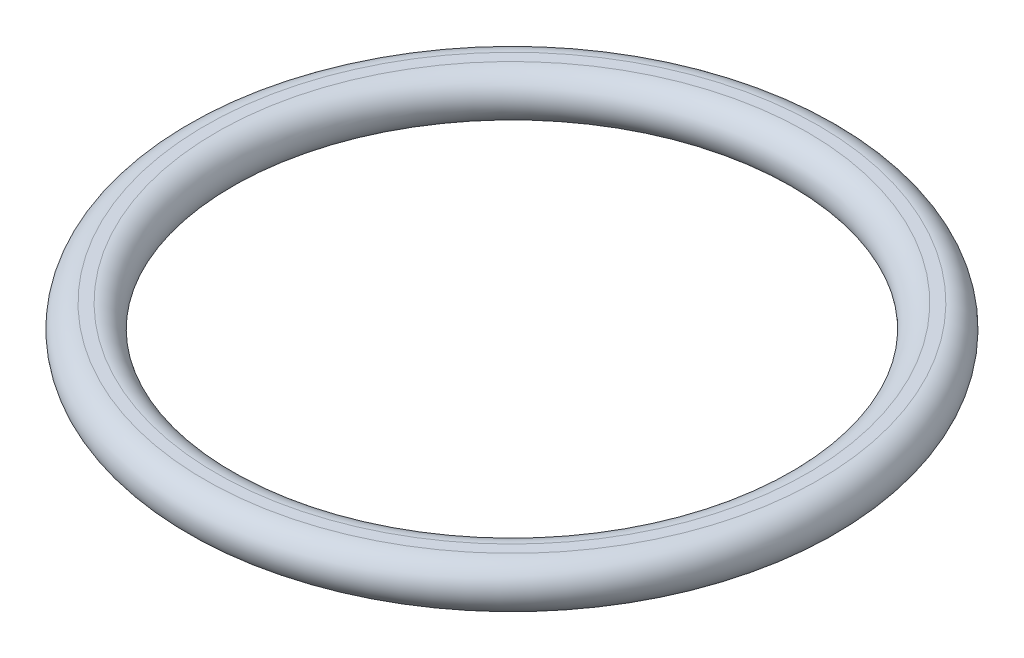
ISO-10303-21;
HEADER;
FILE_DESCRIPTION(('STEP AP214'),'2;1');
FILE_NAME('part.step','',(''),(''),'','','');
FILE_SCHEMA(('AUTOMOTIVE_DESIGN { 1 0 10303 214 1 1 1 1 }'));
ENDSEC;
DATA;
#1=APPLICATION_CONTEXT('core data for automotive mechanical design processes');
#2=APPLICATION_PROTOCOL_DEFINITION('international standard','automotive_design',2000,#1);
#3=PRODUCT_CONTEXT('',#1,'mechanical');
#4=PRODUCT('Part','Part','',(#3));
#5=PRODUCT_RELATED_PRODUCT_CATEGORY('part','',(#4));
#6=PRODUCT_DEFINITION_FORMATION('','',#4);
#7=PRODUCT_DEFINITION_CONTEXT('part definition',#1,'design');
#8=PRODUCT_DEFINITION('design','',#6,#7);
#9=PRODUCT_DEFINITION_SHAPE('','',#8);
#10=(LENGTH_UNIT() NAMED_UNIT(*) SI_UNIT(.MILLI.,.METRE.));
#11=(NAMED_UNIT(*) PLANE_ANGLE_UNIT() SI_UNIT($,.RADIAN.));
#12=(NAMED_UNIT(*) SI_UNIT($,.STERADIAN.) SOLID_ANGLE_UNIT());
#13=UNCERTAINTY_MEASURE_WITH_UNIT(LENGTH_MEASURE(1.E-05),#10,'distance_accuracy_value','');
#14=(GEOMETRIC_REPRESENTATION_CONTEXT(3) GLOBAL_UNCERTAINTY_ASSIGNED_CONTEXT((#13)) GLOBAL_UNIT_ASSIGNED_CONTEXT((#10,
#11,#12)) REPRESENTATION_CONTEXT('',''));
#15=CARTESIAN_POINT('',(0.,0.,0.));
#16=DIRECTION('',(0.,0.,1.));
#17=DIRECTION('',(1.,0.,0.));
#18=AXIS2_PLACEMENT_3D('',#15,#16,#17);
#19=CARTESIAN_POINT('',(0.,0.,0.));
#20=DIRECTION('',(0.,-1.,0.));
#21=DIRECTION('',(0.,0.,-1.));
#22=AXIS2_PLACEMENT_3D('',#19,#20,#21);
#23=TOROIDAL_SURFACE('',#22,20.6375,1.5875);
#24=CARTESIAN_POINT('',(0.,-1.5875,0.));
#25=DIRECTION('',(0.,-1.,0.));
#26=DIRECTION('',(0.,0.,-1.));
#27=AXIS2_PLACEMENT_3D('',#24,#25,#26);
#28=CIRCLE('',#27,20.6375);
#29=CARTESIAN_POINT('',(0.,-1.5875,-20.6375));
#30=VERTEX_POINT('',#29);
#31=EDGE_CURVE('E10',#30,#30,#28,.T.);
#32=ORIENTED_EDGE('',*,*,#31,.T.);
#33=EDGE_LOOP('',(#32));
#34=FACE_BOUND('',#33,.T.);
#35=CARTESIAN_POINT('',(0.,1.5875,0.));
#36=DIRECTION('',(0.,-1.,0.));
#37=DIRECTION('',(0.,0.,-1.));
#38=AXIS2_PLACEMENT_3D('',#35,#36,#37);
#39=CIRCLE('',#38,20.6375);
#40=CARTESIAN_POINT('',(0.,1.5875,-20.6375));
#41=VERTEX_POINT('',#40);
#42=EDGE_CURVE('E53',#41,#41,#39,.T.);
#43=ORIENTED_EDGE('',*,*,#42,.F.);
#44=EDGE_LOOP('',(#43));
#45=FACE_BOUND('',#44,.T.);
#46=ADVANCED_FACE('F39',(#34,#45),#23,.T.);
#47=CARTESIAN_POINT('',(0.,-1.5875,0.));
#48=DIRECTION('',(0.,-1.,0.));
#49=DIRECTION('',(0.,0.,-1.));
#50=AXIS2_PLACEMENT_3D('',#47,#48,#49);
#51=PLANE('',#50);
#52=CARTESIAN_POINT('',(0.,-1.5875,0.));
#53=DIRECTION('',(0.,-1.,0.));
#54=DIRECTION('',(0.,0.,-1.));
#55=AXIS2_PLACEMENT_3D('',#52,#53,#54);
#56=CIRCLE('',#55,21.43125);
#57=CARTESIAN_POINT('',(0.,-1.5875,-21.43125));
#58=VERTEX_POINT('',#57);
#59=EDGE_CURVE('E45',#58,#58,#56,.T.);
#60=ORIENTED_EDGE('',*,*,#59,.T.);
#61=EDGE_LOOP('',(#60));
#62=FACE_BOUND('',#61,.T.);
#63=ORIENTED_EDGE('',*,*,#31,.F.);
#64=EDGE_LOOP('',(#63));
#65=FACE_BOUND('',#64,.T.);
#66=ADVANCED_FACE('F62',(#62,#65),#51,.T.);
#67=CARTESIAN_POINT('',(0.,0.,0.));
#68=DIRECTION('',(0.,-1.,0.));
#69=DIRECTION('',(0.,0.,-1.));
#70=AXIS2_PLACEMENT_3D('',#67,#68,#69);
#71=TOROIDAL_SURFACE('',#70,21.43125,1.5875);
#72=CARTESIAN_POINT('',(0.,1.5875,0.));
#73=DIRECTION('',(0.,-1.,0.));
#74=DIRECTION('',(0.,0.,-1.));
#75=AXIS2_PLACEMENT_3D('',#72,#73,#74);
#76=CIRCLE('',#75,21.43125);
#77=CARTESIAN_POINT('',(0.,1.5875,-21.43125));
#78=VERTEX_POINT('',#77);
#79=EDGE_CURVE('E49',#78,#78,#76,.T.);
#80=ORIENTED_EDGE('',*,*,#79,.T.);
#81=EDGE_LOOP('',(#80));
#82=FACE_BOUND('',#81,.T.);
#83=ORIENTED_EDGE('',*,*,#59,.F.);
#84=EDGE_LOOP('',(#83));
#85=FACE_BOUND('',#84,.T.);
#86=ADVANCED_FACE('F66',(#82,#85),#71,.T.);
#87=CARTESIAN_POINT('',(0.,1.5875,0.));
#88=DIRECTION('',(0.,-1.,0.));
#89=DIRECTION('',(0.,0.,-1.));
#90=AXIS2_PLACEMENT_3D('',#87,#88,#89);
#91=PLANE('',#90);
#92=ORIENTED_EDGE('',*,*,#79,.F.);
#93=EDGE_LOOP('',(#92));
#94=FACE_BOUND('',#93,.T.);
#95=ORIENTED_EDGE('',*,*,#42,.T.);
#96=EDGE_LOOP('',(#95));
#97=FACE_BOUND('',#96,.T.);
#98=ADVANCED_FACE('F59',(#94,#97),#91,.F.);
#99=CLOSED_SHELL('',(#46,#66,#86,#98));
#100=MANIFOLD_SOLID_BREP('B2',#99);
#101=ADVANCED_BREP_SHAPE_REPRESENTATION('',(#18,#100),#14);
#102=SHAPE_DEFINITION_REPRESENTATION(#9,#101);
ENDSEC;
END-ISO-10303-21;
